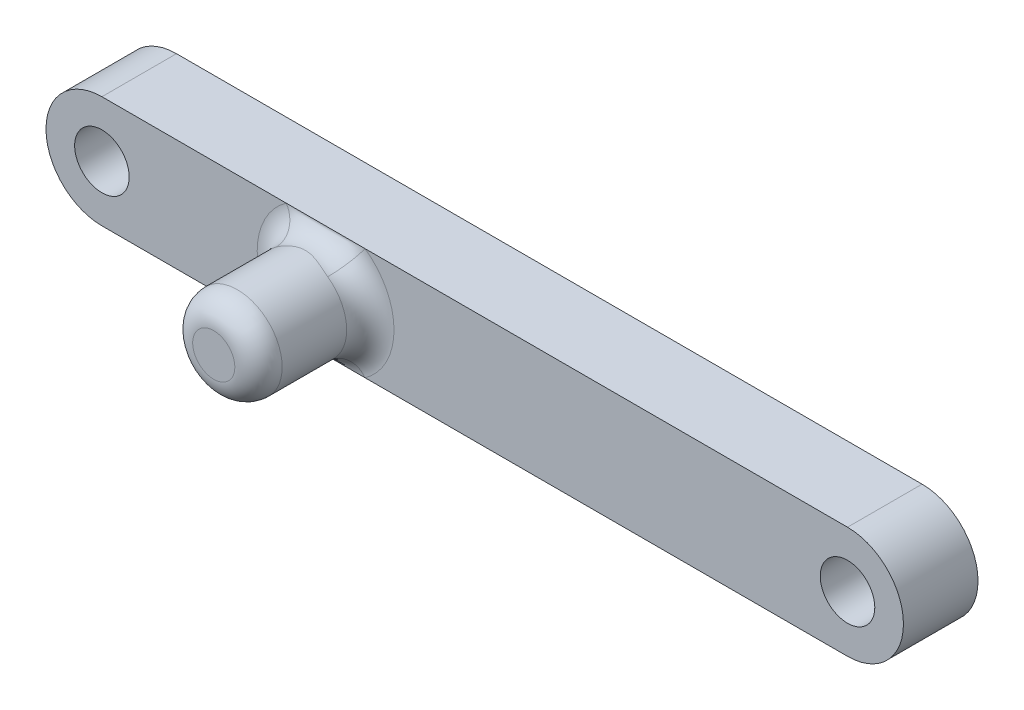
ISO-10303-21;
HEADER;
FILE_DESCRIPTION(('STEP AP214'),'2;1');
FILE_NAME('part.step','',(''),(''),'','','');
FILE_SCHEMA(('AUTOMOTIVE_DESIGN { 1 0 10303 214 1 1 1 1 }'));
ENDSEC;
DATA;
#1=APPLICATION_CONTEXT('core data for automotive mechanical design processes');
#2=APPLICATION_PROTOCOL_DEFINITION('international standard','automotive_design',2000,#1);
#3=PRODUCT_CONTEXT('',#1,'mechanical');
#4=PRODUCT('Part','Part','',(#3));
#5=PRODUCT_RELATED_PRODUCT_CATEGORY('part','',(#4));
#6=PRODUCT_DEFINITION_FORMATION('','',#4);
#7=PRODUCT_DEFINITION_CONTEXT('part definition',#1,'design');
#8=PRODUCT_DEFINITION('design','',#6,#7);
#9=PRODUCT_DEFINITION_SHAPE('','',#8);
#10=(LENGTH_UNIT() NAMED_UNIT(*) SI_UNIT(.MILLI.,.METRE.));
#11=(NAMED_UNIT(*) PLANE_ANGLE_UNIT() SI_UNIT($,.RADIAN.));
#12=(NAMED_UNIT(*) SI_UNIT($,.STERADIAN.) SOLID_ANGLE_UNIT());
#13=UNCERTAINTY_MEASURE_WITH_UNIT(LENGTH_MEASURE(1.E-05),#10,'distance_accuracy_value','');
#14=(GEOMETRIC_REPRESENTATION_CONTEXT(3) GLOBAL_UNCERTAINTY_ASSIGNED_CONTEXT((#13)) GLOBAL_UNIT_ASSIGNED_CONTEXT((#10,
#11,#12)) REPRESENTATION_CONTEXT('',''));
#15=CARTESIAN_POINT('',(0.,0.,0.));
#16=DIRECTION('',(0.,0.,1.));
#17=DIRECTION('',(1.,0.,0.));
#18=AXIS2_PLACEMENT_3D('',#15,#16,#17);
#19=CARTESIAN_POINT('',(0.,0.,10.));
#20=DIRECTION('',(0.,0.,1.));
#21=DIRECTION('',(1.,0.,0.));
#22=AXIS2_PLACEMENT_3D('',#19,#20,#21);
#23=PLANE('',#22);
#24=CARTESIAN_POINT('',(0.,0.,10.));
#25=DIRECTION('',(0.,0.,1.));
#26=DIRECTION('',(1.,0.,0.));
#27=AXIS2_PLACEMENT_3D('',#24,#25,#26);
#28=CIRCLE('',#27,3.6576);
#29=CARTESIAN_POINT('',(3.6576,0.,10.));
#30=VERTEX_POINT('',#29);
#31=EDGE_CURVE('E230',#30,#30,#28,.T.);
#32=ORIENTED_EDGE('',*,*,#31,.F.);
#33=EDGE_LOOP('',(#32));
#34=FACE_BOUND('',#33,.T.);
#35=DIRECTION('',(1.,0.,0.));
#36=VECTOR('',#35,1.);
#37=CARTESIAN_POINT('',(0.,-7.5,10.));
#38=LINE('',#37,#36);
#39=CARTESIAN_POINT('',(0.,-7.5,10.));
#40=VERTEX_POINT('',#39);
#41=CARTESIAN_POINT('',(24.7150567647325,-7.5,10.));
#42=VERTEX_POINT('',#41);
#43=EDGE_CURVE('E112',#40,#42,#38,.T.);
#44=ORIENTED_EDGE('',*,*,#43,.T.);
#45=CARTESIAN_POINT('',(30.,0.,10.));
#46=DIRECTION('',(0.,0.,1.));
#47=DIRECTION('',(1.,0.,0.));
#48=AXIS2_PLACEMENT_3D('',#45,#46,#47);
#49=CIRCLE('',#48,9.175);
#50=CARTESIAN_POINT('',(24.7150567647325,7.5,10.));
#51=VERTEX_POINT('',#50);
#52=EDGE_CURVE('E53',#42,#51,#49,.F.);
#53=ORIENTED_EDGE('',*,*,#52,.T.);
#54=DIRECTION('',(-1.,0.,0.));
#55=VECTOR('',#54,1.);
#56=CARTESIAN_POINT('',(0.,7.5,10.));
#57=LINE('',#56,#55);
#58=CARTESIAN_POINT('',(0.,7.5,10.));
#59=VERTEX_POINT('',#58);
#60=EDGE_CURVE('E126',#51,#59,#57,.T.);
#61=ORIENTED_EDGE('',*,*,#60,.T.);
#62=CARTESIAN_POINT('',(0.,0.,10.));
#63=DIRECTION('',(0.,0.,1.));
#64=DIRECTION('',(1.,0.,0.));
#65=AXIS2_PLACEMENT_3D('',#62,#63,#64);
#66=CIRCLE('',#65,7.5);
#67=EDGE_CURVE('E125',#59,#40,#66,.T.);
#68=ORIENTED_EDGE('',*,*,#67,.T.);
#69=EDGE_LOOP('',(#44,#53,#61,#68));
#70=FACE_BOUND('',#69,.T.);
#71=ADVANCED_FACE('F39',(#34,#70),#23,.T.);
#72=CARTESIAN_POINT('',(100.,7.5,10.));
#73=VERTEX_POINT('',#72);
#74=CARTESIAN_POINT('',(35.2849432352675,7.5,10.));
#75=VERTEX_POINT('',#74);
#76=EDGE_CURVE('E243',#73,#75,#57,.T.);
#77=ORIENTED_EDGE('',*,*,#76,.T.);
#78=CARTESIAN_POINT('',(30.,0.,10.));
#79=DIRECTION('',(0.,0.,1.));
#80=DIRECTION('',(1.,0.,0.));
#81=AXIS2_PLACEMENT_3D('',#78,#79,#80);
#82=CIRCLE('',#81,9.175);
#83=CARTESIAN_POINT('',(35.2849432352675,-7.5,10.));
#84=VERTEX_POINT('',#83);
#85=EDGE_CURVE('E263',#75,#84,#82,.F.);
#86=ORIENTED_EDGE('',*,*,#85,.T.);
#87=CARTESIAN_POINT('',(100.,-7.5,10.));
#88=VERTEX_POINT('',#87);
#89=EDGE_CURVE('E123',#84,#88,#38,.T.);
#90=ORIENTED_EDGE('',*,*,#89,.T.);
#91=CARTESIAN_POINT('',(100.,0.,10.));
#92=DIRECTION('',(0.,0.,1.));
#93=DIRECTION('',(1.,0.,0.));
#94=AXIS2_PLACEMENT_3D('',#91,#92,#93);
#95=CIRCLE('',#94,7.5);
#96=EDGE_CURVE('E121',#88,#73,#95,.T.);
#97=ORIENTED_EDGE('',*,*,#96,.T.);
#98=EDGE_LOOP('',(#77,#86,#90,#97));
#99=FACE_BOUND('',#98,.T.);
#100=CARTESIAN_POINT('',(100.,0.,10.));
#101=DIRECTION('',(0.,0.,1.));
#102=DIRECTION('',(1.,0.,0.));
#103=AXIS2_PLACEMENT_3D('',#100,#101,#102);
#104=CIRCLE('',#103,3.6576);
#105=CARTESIAN_POINT('',(103.6576,0.,10.));
#106=VERTEX_POINT('',#105);
#107=EDGE_CURVE('E237',#106,#106,#104,.T.);
#108=ORIENTED_EDGE('',*,*,#107,.F.);
#109=EDGE_LOOP('',(#108));
#110=FACE_BOUND('',#109,.T.);
#111=ADVANCED_FACE('F181',(#99,#110),#23,.T.);
#112=CARTESIAN_POINT('',(0.,0.,0.));
#113=DIRECTION('',(0.,0.,1.));
#114=DIRECTION('',(1.,0.,0.));
#115=AXIS2_PLACEMENT_3D('',#112,#113,#114);
#116=PLANE('',#115);
#117=CARTESIAN_POINT('',(0.,0.,0.));
#118=DIRECTION('',(0.,0.,1.));
#119=DIRECTION('',(1.,0.,0.));
#120=AXIS2_PLACEMENT_3D('',#117,#118,#119);
#121=CIRCLE('',#120,7.5);
#122=CARTESIAN_POINT('',(0.,7.5,0.));
#123=VERTEX_POINT('',#122);
#124=CARTESIAN_POINT('',(0.,-7.5,0.));
#125=VERTEX_POINT('',#124);
#126=EDGE_CURVE('E134',#123,#125,#121,.T.);
#127=ORIENTED_EDGE('',*,*,#126,.F.);
#128=DIRECTION('',(-1.,0.,0.));
#129=VECTOR('',#128,1.);
#130=CARTESIAN_POINT('',(0.,7.5,0.));
#131=LINE('',#130,#129);
#132=CARTESIAN_POINT('',(100.,7.5,0.));
#133=VERTEX_POINT('',#132);
#134=EDGE_CURVE('E130',#133,#123,#131,.T.);
#135=ORIENTED_EDGE('',*,*,#134,.F.);
#136=CARTESIAN_POINT('',(100.,0.,0.));
#137=DIRECTION('',(0.,0.,1.));
#138=DIRECTION('',(1.,0.,0.));
#139=AXIS2_PLACEMENT_3D('',#136,#137,#138);
#140=CIRCLE('',#139,7.5);
#141=CARTESIAN_POINT('',(100.,-7.5,0.));
#142=VERTEX_POINT('',#141);
#143=EDGE_CURVE('E247',#142,#133,#140,.T.);
#144=ORIENTED_EDGE('',*,*,#143,.F.);
#145=DIRECTION('',(1.,0.,0.));
#146=VECTOR('',#145,1.);
#147=CARTESIAN_POINT('',(0.,-7.5,0.));
#148=LINE('',#147,#146);
#149=EDGE_CURVE('E234',#125,#142,#148,.T.);
#150=ORIENTED_EDGE('',*,*,#149,.F.);
#151=EDGE_LOOP('',(#127,#135,#144,#150));
#152=FACE_BOUND('',#151,.T.);
#153=CARTESIAN_POINT('',(0.,0.,0.));
#154=DIRECTION('',(0.,0.,1.));
#155=DIRECTION('',(1.,0.,0.));
#156=AXIS2_PLACEMENT_3D('',#153,#154,#155);
#157=CIRCLE('',#156,3.6576);
#158=CARTESIAN_POINT('',(3.6576,0.,0.));
#159=VERTEX_POINT('',#158);
#160=EDGE_CURVE('E232',#159,#159,#157,.T.);
#161=ORIENTED_EDGE('',*,*,#160,.T.);
#162=EDGE_LOOP('',(#161));
#163=FACE_BOUND('',#162,.T.);
#164=CARTESIAN_POINT('',(100.,0.,0.));
#165=DIRECTION('',(0.,0.,1.));
#166=DIRECTION('',(1.,0.,0.));
#167=AXIS2_PLACEMENT_3D('',#164,#165,#166);
#168=CIRCLE('',#167,3.6576);
#169=CARTESIAN_POINT('',(103.6576,0.,0.));
#170=VERTEX_POINT('',#169);
#171=EDGE_CURVE('E193',#170,#170,#168,.T.);
#172=ORIENTED_EDGE('',*,*,#171,.T.);
#173=EDGE_LOOP('',(#172));
#174=FACE_BOUND('',#173,.T.);
#175=ADVANCED_FACE('F226',(#152,#163,#174),#116,.F.);
#176=CARTESIAN_POINT('',(0.,0.,10.));
#177=DIRECTION('',(0.,0.,-1.));
#178=DIRECTION('',(-1.,0.,0.));
#179=AXIS2_PLACEMENT_3D('',#176,#177,#178);
#180=CYLINDRICAL_SURFACE('',#179,7.5);
#181=ORIENTED_EDGE('',*,*,#126,.T.);
#182=DIRECTION('',(0.,0.,-1.));
#183=VECTOR('',#182,1.);
#184=CARTESIAN_POINT('',(0.,-7.5,10.));
#185=LINE('',#184,#183);
#186=EDGE_CURVE('E116',#40,#125,#185,.T.);
#187=ORIENTED_EDGE('',*,*,#186,.F.);
#188=ORIENTED_EDGE('',*,*,#67,.F.);
#189=DIRECTION('',(0.,0.,-1.));
#190=VECTOR('',#189,1.);
#191=CARTESIAN_POINT('',(0.,7.5,10.));
#192=LINE('',#191,#190);
#193=EDGE_CURVE('E244',#59,#123,#192,.T.);
#194=ORIENTED_EDGE('',*,*,#193,.T.);
#195=EDGE_LOOP('',(#181,#187,#188,#194));
#196=FACE_BOUND('',#195,.T.);
#197=ADVANCED_FACE('F132',(#196),#180,.T.);
#198=CARTESIAN_POINT('',(0.,-7.5,10.));
#199=DIRECTION('',(0.,1.,0.));
#200=DIRECTION('',(0.,0.,1.));
#201=AXIS2_PLACEMENT_3D('',#198,#199,#200);
#202=PLANE('',#201);
#203=ORIENTED_EDGE('',*,*,#149,.T.);
#204=DIRECTION('',(0.,0.,-1.));
#205=VECTOR('',#204,1.);
#206=CARTESIAN_POINT('',(100.,-7.5,10.));
#207=LINE('',#206,#205);
#208=EDGE_CURVE('E136',#88,#142,#207,.T.);
#209=ORIENTED_EDGE('',*,*,#208,.F.);
#210=ORIENTED_EDGE('',*,*,#89,.F.);
#211=EDGE_CURVE('E120',#42,#84,#38,.T.);
#212=ORIENTED_EDGE('',*,*,#211,.F.);
#213=ORIENTED_EDGE('',*,*,#43,.F.);
#214=ORIENTED_EDGE('',*,*,#186,.T.);
#215=EDGE_LOOP('',(#203,#209,#210,#212,#213,#214));
#216=FACE_BOUND('',#215,.T.);
#217=ADVANCED_FACE('F114',(#216),#202,.F.);
#218=CARTESIAN_POINT('',(100.,0.,10.));
#219=DIRECTION('',(0.,0.,-1.));
#220=DIRECTION('',(-1.,0.,0.));
#221=AXIS2_PLACEMENT_3D('',#218,#219,#220);
#222=CYLINDRICAL_SURFACE('',#221,7.5);
#223=ORIENTED_EDGE('',*,*,#143,.T.);
#224=DIRECTION('',(0.,0.,-1.));
#225=VECTOR('',#224,1.);
#226=CARTESIAN_POINT('',(100.,7.5,10.));
#227=LINE('',#226,#225);
#228=EDGE_CURVE('E142',#73,#133,#227,.T.);
#229=ORIENTED_EDGE('',*,*,#228,.F.);
#230=ORIENTED_EDGE('',*,*,#96,.F.);
#231=ORIENTED_EDGE('',*,*,#208,.T.);
#232=EDGE_LOOP('',(#223,#229,#230,#231));
#233=FACE_BOUND('',#232,.T.);
#234=ADVANCED_FACE('F259',(#233),#222,.T.);
#235=CARTESIAN_POINT('',(0.,7.5,10.));
#236=DIRECTION('',(0.,-1.,0.));
#237=DIRECTION('',(0.,0.,-1.));
#238=AXIS2_PLACEMENT_3D('',#235,#236,#237);
#239=PLANE('',#238);
#240=ORIENTED_EDGE('',*,*,#134,.T.);
#241=ORIENTED_EDGE('',*,*,#193,.F.);
#242=ORIENTED_EDGE('',*,*,#60,.F.);
#243=EDGE_CURVE('E67',#75,#51,#57,.T.);
#244=ORIENTED_EDGE('',*,*,#243,.F.);
#245=ORIENTED_EDGE('',*,*,#76,.F.);
#246=ORIENTED_EDGE('',*,*,#228,.T.);
#247=EDGE_LOOP('',(#240,#241,#242,#244,#245,#246));
#248=FACE_BOUND('',#247,.T.);
#249=ADVANCED_FACE('F185',(#248),#239,.F.);
#250=CARTESIAN_POINT('',(0.,0.,10.));
#251=DIRECTION('',(0.,0.,-1.));
#252=DIRECTION('',(-1.,0.,0.));
#253=AXIS2_PLACEMENT_3D('',#250,#251,#252);
#254=CYLINDRICAL_SURFACE('',#253,3.6576);
#255=ORIENTED_EDGE('',*,*,#31,.T.);
#256=EDGE_LOOP('',(#255));
#257=FACE_BOUND('',#256,.T.);
#258=ORIENTED_EDGE('',*,*,#160,.F.);
#259=EDGE_LOOP('',(#258));
#260=FACE_BOUND('',#259,.T.);
#261=ADVANCED_FACE('F352',(#257,#260),#254,.F.);
#262=CARTESIAN_POINT('',(100.,0.,10.));
#263=DIRECTION('',(0.,0.,-1.));
#264=DIRECTION('',(-1.,0.,0.));
#265=AXIS2_PLACEMENT_3D('',#262,#263,#264);
#266=CYLINDRICAL_SURFACE('',#265,3.6576);
#267=ORIENTED_EDGE('',*,*,#107,.T.);
#268=EDGE_LOOP('',(#267));
#269=FACE_BOUND('',#268,.T.);
#270=ORIENTED_EDGE('',*,*,#171,.F.);
#271=EDGE_LOOP('',(#270));
#272=FACE_BOUND('',#271,.T.);
#273=ADVANCED_FACE('F284',(#269,#272),#266,.F.);
#274=CARTESIAN_POINT('',(30.,0.,25.));
#275=DIRECTION('',(0.,0.,-1.));
#276=DIRECTION('',(-1.,0.,0.));
#277=AXIS2_PLACEMENT_3D('',#274,#275,#276);
#278=CYLINDRICAL_SURFACE('',#277,6.);
#279=CARTESIAN_POINT('',(30.,0.,13.175));
#280=DIRECTION('',(0.,0.,1.));
#281=DIRECTION('',(1.,0.,0.));
#282=AXIS2_PLACEMENT_3D('',#279,#280,#281);
#283=CIRCLE('',#282,6.);
#284=CARTESIAN_POINT('',(26.5439063311602,4.90463215258856,13.175));
#285=VERTEX_POINT('',#284);
#286=CARTESIAN_POINT('',(26.5439063311602,-4.90463215258856,13.175));
#287=VERTEX_POINT('',#286);
#288=EDGE_CURVE('E139',#285,#287,#283,.T.);
#289=ORIENTED_EDGE('',*,*,#288,.T.);
#290=CARTESIAN_POINT('',(25.5669669829592,-4.04329299826589,12.8889082026861));
#291=CARTESIAN_POINT('',(26.4772210505719,-5.04128803284628,8.87900693673398));
#292=CARTESIAN_POINT('',(23.2211536781084,-7.5,10.));
#293=CARTESIAN_POINT('',(25.6229822296809,-4.10474016337067,12.9317363421263));
#294=CARTESIAN_POINT('',(26.4509699333785,-4.98494829048696,8.94901666783968));
#295=CARTESIAN_POINT('',(23.3068103262076,-7.5,10.));
#296=CARTESIAN_POINT('',(25.6811024901604,-4.16586701176025,12.968832398423));
#297=CARTESIAN_POINT('',(26.4298188078775,-4.93981621827615,9.02457923177141));
#298=CARTESIAN_POINT('',(23.3956858911897,-7.5,10.));
#299=CARTESIAN_POINT('',(25.8009654602138,-4.28663758152198,13.03267335236));
#300=CARTESIAN_POINT('',(26.3999989013364,-4.87130013245614,9.17963478321719));
#301=CARTESIAN_POINT('',(23.5789763495683,-7.5,10.));
#302=CARTESIAN_POINT('',(25.8627010028993,-4.34628392435865,13.0594379809215));
#303=CARTESIAN_POINT('',(26.3910507460729,-4.84743836713209,9.25895039779023));
#304=CARTESIAN_POINT('',(23.6733802835979,-7.5,10.));
#305=CARTESIAN_POINT('',(25.9887347139764,-4.46285340702709,13.1036421275061));
#306=CARTESIAN_POINT('',(26.3865351157904,-4.81867252560223,9.41563361301545));
#307=CARTESIAN_POINT('',(23.8661068334579,-7.5,10.));
#308=CARTESIAN_POINT('',(26.0529975990264,-4.51979914898467,13.1211801449361));
#309=CARTESIAN_POINT('',(26.3905407062459,-4.81317518323617,9.4929823649689));
#310=CARTESIAN_POINT('',(23.9643754951784,-7.5,10.));
#311=CARTESIAN_POINT('',(26.1843500284144,-4.63122418975108,13.1485356927104));
#312=CARTESIAN_POINT('',(26.4114000716842,-4.81693313829289,9.64330107730137));
#313=CARTESIAN_POINT('',(24.1652352517831,-7.5,10.));
#314=CARTESIAN_POINT('',(26.2514412917672,-4.68570194561204,13.1583484544436));
#315=CARTESIAN_POINT('',(26.4279897373813,-4.82588520754349,9.71636081965528));
#316=CARTESIAN_POINT('',(24.2678289753272,-7.5,10.));
#317=CARTESIAN_POINT('',(26.4232847895552,-4.81915660131278,13.1747067190602));
#318=CARTESIAN_POINT('',(26.4847526449871,-4.86235997298243,9.8909458135833));
#319=CARTESIAN_POINT('',(24.5306063240285,-7.5,10.));
#320=CARTESIAN_POINT('',(26.5296401600911,-4.8963037247688,13.1769678516294));
#321=CARTESIAN_POINT('',(26.5324424952559,-4.89672642508817,9.98961253743537));
#322=CARTESIAN_POINT('',(24.6932414114726,-7.5,10.));
#323=CARTESIAN_POINT('',(26.7470455233795,-5.04336652253773,13.1699002486503));
#324=CARTESIAN_POINT('',(26.6523099542852,-4.98071690917478,10.1687011909209));
#325=CARTESIAN_POINT('',(25.0256904461678,-7.5,10.));
#326=CARTESIAN_POINT('',(26.8580972453828,-5.11327949991451,13.1605672074633));
#327=CARTESIAN_POINT('',(26.7239002958728,-5.02998231164763,10.2497706293485));
#328=CARTESIAN_POINT('',(25.1955070377312,-7.5,10.));
#329=CARTESIAN_POINT('',(27.19855860536,-5.31236921354693,13.1199441979814));
#330=CARTESIAN_POINT('',(26.9672978136378,-5.18645724422952,10.4636328557361));
#331=CARTESIAN_POINT('',(25.7161292006964,-7.5,10.));
#332=CARTESIAN_POINT('',(27.4341221008171,-5.43000386716694,13.0759953406547));
#333=CARTESIAN_POINT('',(27.1716405422429,-5.30567202331383,10.5750731564631));
#334=CARTESIAN_POINT('',(26.0763450458327,-7.5,10.));
#335=CARTESIAN_POINT('',(27.9324593712012,-5.63940003794259,12.9745759156868));
#336=CARTESIAN_POINT('',(27.6490303193638,-5.53463478174822,10.7447911650842));
#337=CARTESIAN_POINT('',(26.838385788462,-7.5,10.));
#338=CARTESIAN_POINT('',(28.1960161181791,-5.72913732437556,12.9164423864975));
#339=CARTESIAN_POINT('',(27.9265499267676,-5.64570659169011,10.8031567286133));
#340=CARTESIAN_POINT('',(27.2414079807164,-7.5,10.));
#341=CARTESIAN_POINT('',(28.5989953398241,-5.83578804286412,12.8384375756106));
#342=CARTESIAN_POINT('',(28.3720973768654,-5.7816575876033,10.8624305984964));
#343=CARTESIAN_POINT('',(27.8576303738139,-7.5,10.));
#344=CARTESIAN_POINT('',(28.7344485722194,-5.8666611604538,12.8139895538929));
#345=CARTESIAN_POINT('',(28.524361220232,-5.8218271053695,10.8775750885577));
#346=CARTESIAN_POINT('',(28.0647609416841,-7.5,10.));
#347=CARTESIAN_POINT('',(29.0075258275677,-5.91897927148522,12.7706998584466));
#348=CARTESIAN_POINT('',(28.8354677198826,-5.89055270458287,10.9012526106819));
#349=CARTESIAN_POINT('',(28.4823415779876,-7.5,10.));
#350=CARTESIAN_POINT('',(29.1451491556221,-5.94042722196061,12.751856426945));
#351=CARTESIAN_POINT('',(28.9947773931351,-5.91934348649538,10.9098927789759));
#352=CARTESIAN_POINT('',(28.6927905838051,-7.5,10.));
#353=CARTESIAN_POINT('',(29.4494393995016,-5.97702132072375,12.7189649347153));
#354=CARTESIAN_POINT('',(29.3493023174865,-5.96854772449245,10.9238217954188));
#355=CARTESIAN_POINT('',(29.1581010817384,-7.5,10.));
#356=CARTESIAN_POINT('',(29.616445456718,-5.99006952995567,12.7066128309505));
#357=CARTESIAN_POINT('',(29.5464920209929,-5.98644475304943,10.9281936369676));
#358=CARTESIAN_POINT('',(29.4134811775648,-7.5,10.));
#359=CARTESIAN_POINT('',(29.951170302545,-6.00213810118078,12.69521038711));
#360=CARTESIAN_POINT('',(29.9418768738615,-6.00290311938155,10.9322381817446));
#361=CARTESIAN_POINT('',(29.9253312543082,-7.5,10.));
#362=CARTESIAN_POINT('',(30.118889117766,-6.0011579347548,12.6961605481024));
#363=CARTESIAN_POINT('',(30.1411035893687,-6.0015502416789,10.9319318499437));
#364=CARTESIAN_POINT('',(30.1818012759166,-7.5,10.));
#365=CARTESIAN_POINT('',(30.453671694632,-5.98517487446839,12.7112038045376));
#366=CARTESIAN_POINT('',(30.5361774699548,-5.9797759863949,10.9265182650574));
#367=CARTESIAN_POINT('',(30.6937396330419,-7.5,10.));
#368=CARTESIAN_POINT('',(30.6207338758316,-5.97014834948129,12.7253190483889));
#369=CARTESIAN_POINT('',(30.7330462983182,-5.95920792814385,10.9213742619107));
#370=CARTESIAN_POINT('',(30.9492055517944,-7.5,10.));
#371=CARTESIAN_POINT('',(30.9524739976944,-5.92628039986815,12.764311830984));
#372=CARTESIAN_POINT('',(31.1186046370522,-5.90036667934872,10.9042300101128));
#373=CARTESIAN_POINT('',(31.4564914881429,-7.5,10.));
#374=CARTESIAN_POINT('',(31.1171517571547,-5.89743793092382,12.789190183275));
#375=CARTESIAN_POINT('',(31.3082233831363,-5.86179299612625,10.8921279961538));
#376=CARTESIAN_POINT('',(31.7083112286492,-7.5,10.));
#377=CARTESIAN_POINT('',(31.423871323451,-5.83045971594549,12.8423929763754));
#378=CARTESIAN_POINT('',(31.6532851604282,-5.77492733589752,10.8595662892281));
#379=CARTESIAN_POINT('',(32.1773365654437,-7.5,10.));
#380=CARTESIAN_POINT('',(31.566299402411,-5.79381400622619,12.8699691002453));
#381=CARTESIAN_POINT('',(31.8109171795694,-5.72792978473884,10.8400667158781));
#382=CARTESIAN_POINT('',(32.3951328361877,-7.5,10.));
#383=CARTESIAN_POINT('',(31.8479289144523,-5.71023071727664,12.9271077936));
#384=CARTESIAN_POINT('',(32.1138115594845,-5.62449834729478,10.7898242748067));
#385=CARTESIAN_POINT('',(32.8257912983509,-7.5,10.));
#386=CARTESIAN_POINT('',(31.9871302710379,-5.66329289432695,12.9566704101139));
#387=CARTESIAN_POINT('',(32.2594430346449,-5.56771698526649,10.7588046683111));
#388=CARTESIAN_POINT('',(33.0386533727954,-7.5,10.));
#389=CARTESIAN_POINT('',(32.2618614158409,-5.5592767599357,13.0142427087926));
#390=CARTESIAN_POINT('',(32.5351751517084,-5.44812023607145,10.6820672764527));
#391=CARTESIAN_POINT('',(33.4587630817233,-7.5,10.));
#392=CARTESIAN_POINT('',(32.3973907703489,-5.50219725660034,13.0422522079201));
#393=CARTESIAN_POINT('',(32.665451433648,-5.38496614215167,10.6359096015095));
#394=CARTESIAN_POINT('',(33.6660100529926,-7.5,10.));
#395=CARTESIAN_POINT('',(32.6642042739799,-5.37807183980041,13.0929162406209));
#396=CARTESIAN_POINT('',(32.9066865044617,-5.25761147224172,10.5255354204933));
#397=CARTESIAN_POINT('',(34.0740123689618,-7.5,10.));
#398=CARTESIAN_POINT('',(32.7954896934392,-5.31102894294732,13.1155723896664));
#399=CARTESIAN_POINT('',(33.0175780523708,-5.19317172231836,10.4606926649713));
#400=CARTESIAN_POINT('',(34.2747696562177,-7.5,10.));
#401=CARTESIAN_POINT('',(33.1062192079128,-5.13758375338957,13.1588844565465));
#402=CARTESIAN_POINT('',(33.2577035815292,-5.04410925455074,10.2779345885838));
#403=CARTESIAN_POINT('',(34.7499268720996,-7.5,10.));
#404=CARTESIAN_POINT('',(33.2832884823645,-5.02632737612781,13.1748942272467));
#405=CARTESIAN_POINT('',(33.3728122938059,-4.96327076838464,10.1486081742448));
#406=CARTESIAN_POINT('',(35.0206953042823,-7.5,10.));
#407=CARTESIAN_POINT('',(33.6243101846365,-4.78616895009615,13.1751039737547));
#408=CARTESIAN_POINT('',(33.5410889983764,-4.84478779774775,9.84833385568637));
#409=CARTESIAN_POINT('',(35.5421743240067,-7.5,10.));
#410=CARTESIAN_POINT('',(33.7883241207004,-4.65735849135079,13.1594635771331));
#411=CARTESIAN_POINT('',(33.5918815615305,-4.80879738444893,9.67490915842625));
#412=CARTESIAN_POINT('',(35.7929789679043,-7.5,10.));
#413=CARTESIAN_POINT('',(34.0014314234944,-4.4715160896422,13.106133666053));
#414=CARTESIAN_POINT('',(33.6127843516415,-4.81812781963778,9.42778372166664));
#415=CARTESIAN_POINT('',(36.1188555517602,-7.5,10.));
#416=CARTESIAN_POINT('',(34.0578960571341,-4.42032100086197,13.0885115846629));
#417=CARTESIAN_POINT('',(33.6133228692582,-4.82702284172874,9.35840971700718));
#418=CARTESIAN_POINT('',(36.2051993873676,-7.5,10.));
#419=CARTESIAN_POINT('',(34.1682139522841,-4.31644694443828,13.0460475485204));
#420=CARTESIAN_POINT('',(33.6046145861499,-4.85922684866008,9.21955049080244));
#421=CARTESIAN_POINT('',(36.3738938353679,-7.5,10.));
#422=CARTESIAN_POINT('',(34.2220685316292,-4.26376874732277,13.0212092825313));
#423=CARTESIAN_POINT('',(33.5951784960209,-4.8828104288008,9.15009342172199));
#424=CARTESIAN_POINT('',(36.4562464629496,-7.5,10.));
#425=CARTESIAN_POINT('',(34.3273801234203,-4.15685640820346,12.9632217901432));
#426=CARTESIAN_POINT('',(33.5668903505693,-4.94676682133864,9.01371314589371));
#427=CARTESIAN_POINT('',(36.6172854387302,-7.5,10.));
#428=CARTESIAN_POINT('',(34.3788083387217,-4.10261205771451,12.929993210177));
#429=CARTESIAN_POINT('',(33.5477713565804,-4.98760643034872,8.94695947051001));
#430=CARTESIAN_POINT('',(36.6959277512957,-7.5,10.));
#431=CARTESIAN_POINT('',(34.4784218739805,-3.99365085442563,12.854546971049));
#432=CARTESIAN_POINT('',(33.5014747271117,-5.0870447703254,8.82099735697241));
#433=CARTESIAN_POINT('',(36.8482534489624,-7.5,10.));
#434=CARTESIAN_POINT('',(34.5266017737468,-3.93893337577406,12.8123147541392));
#435=CARTESIAN_POINT('',(33.474156292756,-5.14595556004996,8.7620369136544));
#436=CARTESIAN_POINT('',(36.9219285456883,-7.5,10.));
#437=CARTESIAN_POINT('',(34.5729367163089,-3.8843596368815,12.7652314188446));
#438=CARTESIAN_POINT('',(33.4439800423648,-5.21344548577719,8.70990679598452));
#439=CARTESIAN_POINT('',(36.9927823953557,-7.5,10.));
#440=(BOUNDED_SURFACE() B_SPLINE_SURFACE(3,2,((#290,#291,#292),(#293,#294,#295),(#296,#297,
#298),(#299,#300,#301),(#302,#303,#304),(#305,#306,#307),(#308,#309,#310),(#311,#312,#313),
(#314,#315,#316),(#317,#318,#319),(#320,#321,#322),(#323,#324,#325),(#326,#327,#328),(#329,#330,
#331),(#332,#333,#334),(#335,#336,#337),(#338,#339,#340),(#341,#342,#343),(#344,#345,#346),
(#347,#348,#349),(#350,#351,#352),(#353,#354,#355),(#356,#357,#358),(#359,#360,#361),(#362,#363,
#364),(#365,#366,#367),(#368,#369,#370),(#371,#372,#373),(#374,#375,#376),(#377,#378,#379),
(#380,#381,#382),(#383,#384,#385),(#386,#387,#388),(#389,#390,#391),(#392,#393,#394),(#395,#396,
#397),(#398,#399,#400),(#401,#402,#403),(#404,#405,#406),(#407,#408,#409),(#410,#411,#412),
(#413,#414,#415),(#416,#417,#418),(#419,#420,#421),(#422,#423,#424),(#425,#426,#427),(#428,#429,
#430),(#431,#432,#433),(#434,#435,#436),(#437,#438,#439)),.UNSPECIFIED.,.F.,.F.,
.F.) B_SPLINE_SURFACE_WITH_KNOTS((4,2,2,2,2,2,2,2,2,2,2,2,2,2,2,2,2,2,2,2,2,2,2,2,4),(3,3),(0.,
0.40216567703318,0.803559454102876,1.20057640398108,1.59783823096835,2.1996644205517,
2.80171417250746,4.0124231742884,5.29723361670402,5.93828512862059,6.57913537443763,
7.34727801974771,8.11544959943853,8.88491585584337,9.65444028377354,10.3335518200165,
11.0126794395017,11.6918869258353,12.3708891862567,13.32886103317,14.2820133928772,
14.6353918066473,14.9885898976106,15.3452624958731,15.7025162228286),(0.,1.),
.UNSPECIFIED.) GEOMETRIC_REPRESENTATION_ITEM() RATIONAL_B_SPLINE_SURFACE(((1.,0.60018485670738,
1.),(1.,0.606719965358706,1.),(1.,0.613497757085728,1.),(1.,0.627358452783652,1.),(1.,
0.634440746165938,1.),(1.,0.648678508354341,1.),(1.,0.655832337173973,1.),(1.,0.670154094336123,
1.),(1.,0.67732202865357,1.),(1.,0.695214830179623,1.),(1.,0.705870647800572,1.),(1.,
0.726617906091147,1.),(1.,0.736709135639371,1.),(1.,0.7658992127339,1.),(1.,0.783790551460652,
1.),(1.,0.816162898588367,1.),(1.,0.830368155853741,1.),(1.,0.847396738228987,1.),(1.,
0.852356724602753,1.),(1.,0.860790389515784,1.),(1.,0.864264534210971,1.),(1.,0.870201947963986,
1.),(1.,0.87232735714094,1.),(1.,0.874292914689489,1.),(1.,0.874132976976914,1.),(1.,
0.871530623703545,1.),(1.,0.869084361707909,1.),(1.,0.861972900245613,1.),(1.,0.857307533041618,
1.),(1.,0.846544731335144,1.),(1.,0.840679955501191,1.),(1.,0.827407906740637,1.),(1.,
0.820000597286721,1.),(1.,0.803756643489336,1.),(1.,0.794919831155497,1.),(1.,0.775969416783193,
1.),(1.,0.765856201339854,1.),(1.,0.740165270888249,1.),(1.,0.724049560286579,1.),(1.,
0.690613948944646,1.),(1.,0.673300514290457,1.),(1.,0.649776518353478,1.),(1.,0.643434856415344,
1.),(1.,0.630897619600107,1.),(1.,0.624701971828634,1.),(1.,0.612506950329412,1.),(1.,
0.606510106969,1.),(1.,0.594890273800683,1.),(1.,0.58926790903394,1.),(1.,0.583899268595504,1.))) REPRESENTATION_ITEM('') SURFACE());
#441=CARTESIAN_POINT('',(25.5669669829592,-4.04329299826589,12.8889082026861));
#442=CARTESIAN_POINT('',(25.6229822296809,-4.10474016337067,12.9317363421263));
#443=CARTESIAN_POINT('',(25.6811024901604,-4.16586701176025,12.968832398423));
#444=CARTESIAN_POINT('',(25.8009654602138,-4.28663758152198,13.03267335236));
#445=CARTESIAN_POINT('',(25.8627010028993,-4.34628392435865,13.0594379809215));
#446=CARTESIAN_POINT('',(25.9887347139764,-4.46285340702709,13.1036421275061));
#447=CARTESIAN_POINT('',(26.0529975990264,-4.51979914898467,13.1211801449361));
#448=CARTESIAN_POINT('',(26.1843500284144,-4.63122418975108,13.1485356927104));
#449=CARTESIAN_POINT('',(26.2514412917672,-4.68570194561204,13.1583484544436));
#450=CARTESIAN_POINT('',(26.4232847895552,-4.81915660131278,13.1747067190602));
#451=CARTESIAN_POINT('',(26.5296401600911,-4.8963037247688,13.1769678516294));
#452=CARTESIAN_POINT('',(26.7470455233795,-5.04336652253773,13.1699002486503));
#453=CARTESIAN_POINT('',(26.8580972453828,-5.11327949991451,13.1605672074633));
#454=CARTESIAN_POINT('',(27.19855860536,-5.31236921354693,13.1199441979814));
#455=CARTESIAN_POINT('',(27.4341221008171,-5.43000386716694,13.0759953406547));
#456=CARTESIAN_POINT('',(27.9324593712012,-5.63940003794259,12.9745759156868));
#457=CARTESIAN_POINT('',(28.1960161181791,-5.72913732437556,12.9164423864975));
#458=CARTESIAN_POINT('',(28.5989953398241,-5.83578804286412,12.8384375756106));
#459=CARTESIAN_POINT('',(28.7344485722194,-5.86666116045381,12.8139895538929));
#460=CARTESIAN_POINT('',(29.0075258275677,-5.91897927148522,12.7706998584466));
#461=CARTESIAN_POINT('',(29.1451491556221,-5.94042722196061,12.751856426945));
#462=CARTESIAN_POINT('',(29.4494393995016,-5.97702132072375,12.7189649347153));
#463=CARTESIAN_POINT('',(29.616445456718,-5.99006952995567,12.7066128309505));
#464=CARTESIAN_POINT('',(29.951170302545,-6.00213810118078,12.69521038711));
#465=CARTESIAN_POINT('',(30.118889117766,-6.0011579347548,12.6961605481024));
#466=CARTESIAN_POINT('',(30.453671694632,-5.98517487446839,12.7112038045376));
#467=CARTESIAN_POINT('',(30.6207338758316,-5.97014834948129,12.7253190483889));
#468=CARTESIAN_POINT('',(30.9524739976944,-5.92628039986815,12.764311830984));
#469=CARTESIAN_POINT('',(31.1171517571547,-5.89743793092382,12.789190183275));
#470=CARTESIAN_POINT('',(31.423871323451,-5.83045971594549,12.8423929763754));
#471=CARTESIAN_POINT('',(31.566299402411,-5.79381400622619,12.8699691002453));
#472=CARTESIAN_POINT('',(31.8479289144523,-5.71023071727664,12.9271077936));
#473=CARTESIAN_POINT('',(31.9871302710379,-5.66329289432695,12.9566704101139));
#474=CARTESIAN_POINT('',(32.2618614158409,-5.5592767599357,13.0142427087926));
#475=CARTESIAN_POINT('',(32.3973907703489,-5.50219725660034,13.0422522079201));
#476=CARTESIAN_POINT('',(32.6642042739799,-5.37807183980041,13.0929162406209));
#477=CARTESIAN_POINT('',(32.7954896934392,-5.31102894294732,13.1155723896664));
#478=CARTESIAN_POINT('',(33.1062192079128,-5.13758375338957,13.1588844565465));
#479=CARTESIAN_POINT('',(33.2832884823645,-5.02632737612781,13.1748942272467));
#480=CARTESIAN_POINT('',(33.6243101846365,-4.78616895009615,13.1751039737547));
#481=CARTESIAN_POINT('',(33.7883241207004,-4.65735849135079,13.1594635771331));
#482=CARTESIAN_POINT('',(34.0014314234944,-4.4715160896422,13.106133666053));
#483=CARTESIAN_POINT('',(34.0578960571341,-4.42032100086197,13.0885115846629));
#484=CARTESIAN_POINT('',(34.1682139522841,-4.31644694443828,13.0460475485204));
#485=CARTESIAN_POINT('',(34.2220685316292,-4.26376874732277,13.0212092825313));
#486=CARTESIAN_POINT('',(34.3273801234203,-4.15685640820346,12.9632217901432));
#487=CARTESIAN_POINT('',(34.3788083387217,-4.10261205771451,12.929993210177));
#488=CARTESIAN_POINT('',(34.4784218739805,-3.99365085442563,12.854546971049));
#489=CARTESIAN_POINT('',(34.5266017737468,-3.93893337577406,12.8123147541392));
#490=CARTESIAN_POINT('',(34.5729367163089,-3.8843596368815,12.7652314188446));
#491=B_SPLINE_CURVE_WITH_KNOTS('',3,(#441,#442,#443,#444,#445,#446,#447,#448,#449,#450,#451,
#452,#453,#454,#455,#456,#457,#458,#459,#460,#461,#462,#463,#464,#465,#466,#467,#468,#469,#470,
#471,#472,#473,#474,#475,#476,#477,#478,#479,#480,#481,#482,#483,#484,#485,#486,#487,#488,#489,
#490),.UNSPECIFIED.,.F.,.F.,(4,2,2,2,2,2,2,2,2,2,2,2,2,2,2,2,2,2,2,2,2,2,2,2,4),(0.,
0.40216567703318,0.803559454102876,1.20057640398108,1.59783823096835,2.1996644205517,
2.80171417250746,4.0124231742884,5.29723361670402,5.93828512862059,6.57913537443763,
7.34727801974771,8.11544959943853,8.88491585584337,9.65444028377354,10.3335518200165,
11.0126794395017,11.6918869258353,12.3708891862567,13.32886103317,14.2820133928772,
14.6353918066473,14.9885898976106,15.3452624958731,15.7025162228286),.UNSPECIFIED.);
#492=CARTESIAN_POINT('',(33.4560936688398,-4.90463215258856,13.175));
#493=VERTEX_POINT('',#492);
#494=EDGE_CURVE('E273',#287,#493,#491,.T.);
#495=ORIENTED_EDGE('',*,*,#494,.T.);
#496=CARTESIAN_POINT('',(30.,0.,13.175));
#497=DIRECTION('',(0.,0.,1.));
#498=DIRECTION('',(1.,0.,0.));
#499=AXIS2_PLACEMENT_3D('',#496,#497,#498);
#500=CIRCLE('',#499,6.);
#501=CARTESIAN_POINT('',(33.4560936688398,4.90463215258856,13.175));
#502=VERTEX_POINT('',#501);
#503=EDGE_CURVE('E155',#493,#502,#500,.T.);
#504=ORIENTED_EDGE('',*,*,#503,.T.);
#505=CARTESIAN_POINT('',(34.4330330170408,4.04329299826589,12.8889082026861));
#506=CARTESIAN_POINT('',(33.5227789494281,5.04128803284628,8.87900693673399));
#507=CARTESIAN_POINT('',(36.7788463218916,7.5,10.));
#508=CARTESIAN_POINT('',(34.3770177703191,4.10474016337067,12.9317363421263));
#509=CARTESIAN_POINT('',(33.5490300666215,4.98494829048695,8.94901666783969));
#510=CARTESIAN_POINT('',(36.6931896737924,7.5,10.));
#511=CARTESIAN_POINT('',(34.3188975098396,4.16586701176025,12.968832398423));
#512=CARTESIAN_POINT('',(33.5701811921225,4.93981621827614,9.0245792317714));
#513=CARTESIAN_POINT('',(36.6043141088103,7.5,10.));
#514=CARTESIAN_POINT('',(34.1990345397862,4.28663758152198,13.03267335236));
#515=CARTESIAN_POINT('',(33.6000010986636,4.87130013245614,9.17963478321719));
#516=CARTESIAN_POINT('',(36.4210236504317,7.5,10.));
#517=CARTESIAN_POINT('',(34.1372989971007,4.34628392435865,13.0594379809215));
#518=CARTESIAN_POINT('',(33.6089492539271,4.84743836713208,9.25895039779023));
#519=CARTESIAN_POINT('',(36.3266197164021,7.5,10.));
#520=CARTESIAN_POINT('',(34.0112652860236,4.46285340702709,13.1036421275061));
#521=CARTESIAN_POINT('',(33.6134648842096,4.81867252560223,9.41563361301545));
#522=CARTESIAN_POINT('',(36.1338931665421,7.5,10.));
#523=CARTESIAN_POINT('',(33.9470024009736,4.51979914898467,13.1211801449361));
#524=CARTESIAN_POINT('',(33.6094592937541,4.81317518323617,9.49298236496891));
#525=CARTESIAN_POINT('',(36.0356245048216,7.5,10.));
#526=CARTESIAN_POINT('',(33.8156499715856,4.63122418975108,13.1485356927105));
#527=CARTESIAN_POINT('',(33.5885999283158,4.81693313829289,9.64330107730138));
#528=CARTESIAN_POINT('',(35.8347647482169,7.5,10.));
#529=CARTESIAN_POINT('',(33.7485587082328,4.68570194561204,13.1583484544436));
#530=CARTESIAN_POINT('',(33.5720102626187,4.82588520754349,9.71636081965528));
#531=CARTESIAN_POINT('',(35.7321710246728,7.5,10.));
#532=CARTESIAN_POINT('',(33.5767152104448,4.81915660131279,13.1747067190602));
#533=CARTESIAN_POINT('',(33.5152473550129,4.86235997298243,9.8909458135833));
#534=CARTESIAN_POINT('',(35.4693936759715,7.5,10.));
#535=CARTESIAN_POINT('',(33.4703598399089,4.8963037247688,13.1769678516294));
#536=CARTESIAN_POINT('',(33.4675575047441,4.89672642508817,9.98961253743538));
#537=CARTESIAN_POINT('',(35.3067585885274,7.5,10.));
#538=CARTESIAN_POINT('',(33.2529544766205,5.04336652253774,13.1699002486503));
#539=CARTESIAN_POINT('',(33.3476900457148,4.98071690917478,10.1687011909209));
#540=CARTESIAN_POINT('',(34.9743095538322,7.5,10.));
#541=CARTESIAN_POINT('',(33.1419027546172,5.11327949991451,13.1605672074633));
#542=CARTESIAN_POINT('',(33.2760997041272,5.02998231164763,10.2497706293485));
#543=CARTESIAN_POINT('',(34.8044929622688,7.5,10.));
#544=CARTESIAN_POINT('',(32.80144139464,5.31236921354693,13.1199441979814));
#545=CARTESIAN_POINT('',(33.0327021863622,5.18645724422953,10.4636328557361));
#546=CARTESIAN_POINT('',(34.2838707993036,7.5,10.));
#547=CARTESIAN_POINT('',(32.5658778991829,5.43000386716694,13.0759953406547));
#548=CARTESIAN_POINT('',(32.8283594577571,5.30567202331383,10.5750731564631));
#549=CARTESIAN_POINT('',(33.9236549541673,7.5,10.));
#550=CARTESIAN_POINT('',(32.0675406287988,5.63940003794259,12.9745759156868));
#551=CARTESIAN_POINT('',(32.3509696806362,5.53463478174822,10.7447911650842));
#552=CARTESIAN_POINT('',(33.1616142115379,7.5,10.));
#553=CARTESIAN_POINT('',(31.8039838818209,5.72913732437556,12.9164423864975));
#554=CARTESIAN_POINT('',(32.0734500732324,5.64570659169011,10.8031567286133));
#555=CARTESIAN_POINT('',(32.7585920192836,7.5,10.));
#556=CARTESIAN_POINT('',(31.4010046601759,5.83578804286412,12.8384375756106));
#557=CARTESIAN_POINT('',(31.6279026231346,5.7816575876033,10.8624305984964));
#558=CARTESIAN_POINT('',(32.1423696261861,7.5,10.));
#559=CARTESIAN_POINT('',(31.2655514277806,5.8666611604538,12.8139895538929));
#560=CARTESIAN_POINT('',(31.475638779768,5.8218271053695,10.8775750885577));
#561=CARTESIAN_POINT('',(31.9352390583159,7.5,10.));
#562=CARTESIAN_POINT('',(30.9924741724323,5.91897927148522,12.7706998584466));
#563=CARTESIAN_POINT('',(31.1645322801174,5.89055270458287,10.9012526106819));
#564=CARTESIAN_POINT('',(31.5176584220124,7.5,10.));
#565=CARTESIAN_POINT('',(30.8548508443779,5.94042722196061,12.751856426945));
#566=CARTESIAN_POINT('',(31.0052226068649,5.91934348649538,10.9098927789759));
#567=CARTESIAN_POINT('',(31.3072094161949,7.5,10.));
#568=CARTESIAN_POINT('',(30.5505606004984,5.97702132072375,12.7189649347153));
#569=CARTESIAN_POINT('',(30.6506976825135,5.96854772449245,10.9238217954188));
#570=CARTESIAN_POINT('',(30.8418989182616,7.5,10.));
#571=CARTESIAN_POINT('',(30.383554543282,5.99006952995567,12.7066128309505));
#572=CARTESIAN_POINT('',(30.4535079790071,5.98644475304943,10.9281936369676));
#573=CARTESIAN_POINT('',(30.5865188224352,7.5,10.));
#574=CARTESIAN_POINT('',(30.0488296974549,6.00213810118078,12.69521038711));
#575=CARTESIAN_POINT('',(30.0581231261385,6.00290311938155,10.9322381817446));
#576=CARTESIAN_POINT('',(30.0746687456918,7.5,10.));
#577=CARTESIAN_POINT('',(29.881110882234,6.0011579347548,12.6961605481024));
#578=CARTESIAN_POINT('',(29.8588964106313,6.0015502416789,10.9319318499437));
#579=CARTESIAN_POINT('',(29.8181987240834,7.5,10.));
#580=CARTESIAN_POINT('',(29.546328305368,5.98517487446839,12.7112038045376));
#581=CARTESIAN_POINT('',(29.4638225300452,5.9797759863949,10.9265182650574));
#582=CARTESIAN_POINT('',(29.3062603669581,7.5,10.));
#583=CARTESIAN_POINT('',(29.3792661241684,5.97014834948129,12.7253190483889));
#584=CARTESIAN_POINT('',(29.2669537016818,5.95920792814385,10.9213742619107));
#585=CARTESIAN_POINT('',(29.0507944482056,7.5,10.));
#586=CARTESIAN_POINT('',(29.0475260023055,5.92628039986815,12.764311830984));
#587=CARTESIAN_POINT('',(28.8813953629478,5.90036667934872,10.9042300101128));
#588=CARTESIAN_POINT('',(28.5435085118571,7.5,10.));
#589=CARTESIAN_POINT('',(28.8828482428453,5.89743793092382,12.789190183275));
#590=CARTESIAN_POINT('',(28.6917766168637,5.86179299612625,10.8921279961538));
#591=CARTESIAN_POINT('',(28.2916887713508,7.5,10.));
#592=CARTESIAN_POINT('',(28.5761286765489,5.83045971594549,12.8423929763754));
#593=CARTESIAN_POINT('',(28.3467148395717,5.77492733589751,10.8595662892281));
#594=CARTESIAN_POINT('',(27.8226634345562,7.5,10.));
#595=CARTESIAN_POINT('',(28.433700597589,5.79381400622619,12.8699691002453));
#596=CARTESIAN_POINT('',(28.1890828204306,5.72792978473883,10.8400667158781));
#597=CARTESIAN_POINT('',(27.6048671638123,7.5,10.));
#598=CARTESIAN_POINT('',(28.1520710855477,5.71023071727663,12.9271077936));
#599=CARTESIAN_POINT('',(27.8861884405155,5.62449834729478,10.7898242748067));
#600=CARTESIAN_POINT('',(27.174208701649,7.5,10.));
#601=CARTESIAN_POINT('',(28.0128697289621,5.66329289432695,12.9566704101139));
#602=CARTESIAN_POINT('',(27.7405569653551,5.56771698526649,10.7588046683111));
#603=CARTESIAN_POINT('',(26.9613466272045,7.5,10.));
#604=CARTESIAN_POINT('',(27.7381385841591,5.5592767599357,13.0142427087926));
#605=CARTESIAN_POINT('',(27.4648248482916,5.44812023607144,10.6820672764527));
#606=CARTESIAN_POINT('',(26.5412369182767,7.5,10.));
#607=CARTESIAN_POINT('',(27.6026092296511,5.50219725660034,13.0422522079201));
#608=CARTESIAN_POINT('',(27.334548566352,5.38496614215167,10.6359096015095));
#609=CARTESIAN_POINT('',(26.3339899470074,7.5,10.));
#610=CARTESIAN_POINT('',(27.3357957260201,5.3780718398004,13.0929162406209));
#611=CARTESIAN_POINT('',(27.0933134955383,5.25761147224171,10.5255354204933));
#612=CARTESIAN_POINT('',(25.9259876310382,7.5,10.));
#613=CARTESIAN_POINT('',(27.2045103065608,5.31102894294732,13.1155723896664));
#614=CARTESIAN_POINT('',(26.9824219476292,5.19317172231835,10.4606926649713));
#615=CARTESIAN_POINT('',(25.7252303437823,7.5,10.));
#616=CARTESIAN_POINT('',(26.8937807920872,5.13758375338956,13.1588844565465));
#617=CARTESIAN_POINT('',(26.7422964184708,5.04410925455074,10.2779345885838));
#618=CARTESIAN_POINT('',(25.2500731279004,7.5,10.));
#619=CARTESIAN_POINT('',(26.7167115176355,5.0263273761278,13.1748942272467));
#620=CARTESIAN_POINT('',(26.6271877061941,4.96327076838464,10.1486081742447));
#621=CARTESIAN_POINT('',(24.9793046957177,7.5,10.));
#622=CARTESIAN_POINT('',(26.3756898153635,4.78616895009615,13.1751039737547));
#623=CARTESIAN_POINT('',(26.4589110016236,4.84478779774775,9.84833385568637));
#624=CARTESIAN_POINT('',(24.4578256759932,7.5,10.));
#625=CARTESIAN_POINT('',(26.2116758792996,4.65735849135078,13.1594635771331));
#626=CARTESIAN_POINT('',(26.4081184384695,4.80879738444893,9.67490915842625));
#627=CARTESIAN_POINT('',(24.2070210320957,7.5,10.));
#628=CARTESIAN_POINT('',(25.9985685765056,4.4715160896422,13.106133666053));
#629=CARTESIAN_POINT('',(26.3872156483585,4.81812781963778,9.42778372166663));
#630=CARTESIAN_POINT('',(23.8811444482398,7.5,10.));
#631=CARTESIAN_POINT('',(25.9421039428659,4.42032100086197,13.0885115846629));
#632=CARTESIAN_POINT('',(26.3866771307418,4.82702284172874,9.35840971700717));
#633=CARTESIAN_POINT('',(23.7948006126324,7.5,10.));
#634=CARTESIAN_POINT('',(25.8317860477159,4.31644694443827,13.0460475485204));
#635=CARTESIAN_POINT('',(26.39538541385,4.85922684866008,9.21955049080244));
#636=CARTESIAN_POINT('',(23.6261061646321,7.5,10.));
#637=CARTESIAN_POINT('',(25.7779314683708,4.26376874732277,13.0212092825313));
#638=CARTESIAN_POINT('',(26.4048215039791,4.8828104288008,9.15009342172199));
#639=CARTESIAN_POINT('',(23.5437535370504,7.5,10.));
#640=CARTESIAN_POINT('',(25.6726198765797,4.15685640820346,12.9632217901432));
#641=CARTESIAN_POINT('',(26.4331096494307,4.94676682133864,9.01371314589371));
#642=CARTESIAN_POINT('',(23.3827145612697,7.5,10.));
#643=CARTESIAN_POINT('',(25.6211916612783,4.10261205771451,12.929993210177));
#644=CARTESIAN_POINT('',(26.4522286434196,4.98760643034872,8.94695947051001));
#645=CARTESIAN_POINT('',(23.3040722487043,7.5,10.));
#646=CARTESIAN_POINT('',(25.5215781260195,3.99365085442563,12.854546971049));
#647=CARTESIAN_POINT('',(26.4985252728883,5.0870447703254,8.82099735697242));
#648=CARTESIAN_POINT('',(23.1517465510376,7.5,10.));
#649=CARTESIAN_POINT('',(25.4733982262532,3.93893337577406,12.8123147541392));
#650=CARTESIAN_POINT('',(26.525843707244,5.14595556004996,8.7620369136544));
#651=CARTESIAN_POINT('',(23.0780714543117,7.5,10.));
#652=CARTESIAN_POINT('',(25.4270632836911,3.8843596368815,12.7652314188446));
#653=CARTESIAN_POINT('',(26.5560199576352,5.2134454857772,8.70990679598452));
#654=CARTESIAN_POINT('',(23.0072176046443,7.5,10.));
#655=(BOUNDED_SURFACE() B_SPLINE_SURFACE(3,2,((#505,#506,#507),(#508,#509,#510),(#511,#512,
#513),(#514,#515,#516),(#517,#518,#519),(#520,#521,#522),(#523,#524,#525),(#526,#527,#528),
(#529,#530,#531),(#532,#533,#534),(#535,#536,#537),(#538,#539,#540),(#541,#542,#543),(#544,#545,
#546),(#547,#548,#549),(#550,#551,#552),(#553,#554,#555),(#556,#557,#558),(#559,#560,#561),
(#562,#563,#564),(#565,#566,#567),(#568,#569,#570),(#571,#572,#573),(#574,#575,#576),(#577,#578,
#579),(#580,#581,#582),(#583,#584,#585),(#586,#587,#588),(#589,#590,#591),(#592,#593,#594),
(#595,#596,#597),(#598,#599,#600),(#601,#602,#603),(#604,#605,#606),(#607,#608,#609),(#610,#611,
#612),(#613,#614,#615),(#616,#617,#618),(#619,#620,#621),(#622,#623,#624),(#625,#626,#627),
(#628,#629,#630),(#631,#632,#633),(#634,#635,#636),(#637,#638,#639),(#640,#641,#642),(#643,#644,
#645),(#646,#647,#648),(#649,#650,#651),(#652,#653,#654)),.UNSPECIFIED.,.F.,.F.,
.F.) B_SPLINE_SURFACE_WITH_KNOTS((4,2,2,2,2,2,2,2,2,2,2,2,2,2,2,2,2,2,2,2,2,2,2,2,4),(3,3),(0.,
0.40216567703318,0.803559454102878,1.20057640398109,1.59783823096836,2.1996644205517,
2.80171417250746,4.0124231742884,5.29723361670402,5.93828512862058,6.57913537443762,
7.34727801974771,8.11544959943853,8.88491585584337,9.65444028377355,10.3335518200165,
11.0126794395017,11.6918869258353,12.3708891862567,13.32886103317,14.2820133928772,
14.6353918066473,14.9885898976106,15.3452624958731,15.7025162228286),(0.,1.),
.UNSPECIFIED.) GEOMETRIC_REPRESENTATION_ITEM() RATIONAL_B_SPLINE_SURFACE(((1.,0.60018485670738,
1.),(1.,0.606719965358706,1.),(1.,0.613497757085728,1.),(1.,0.627358452783652,1.),(1.,
0.634440746165938,1.),(1.,0.648678508354342,1.),(1.,0.655832337173974,1.),(1.,0.670154094336124,
1.),(1.,0.67732202865357,1.),(1.,0.695214830179623,1.),(1.,0.705870647800572,1.),(1.,
0.726617906091147,1.),(1.,0.736709135639371,1.),(1.,0.7658992127339,1.),(1.,0.783790551460652,
1.),(1.,0.816162898588367,1.),(1.,0.830368155853741,1.),(1.,0.847396738228987,1.),(1.,
0.852356724602753,1.),(1.,0.860790389515784,1.),(1.,0.864264534210971,1.),(1.,0.870201947963986,
1.),(1.,0.87232735714094,1.),(1.,0.874292914689489,1.),(1.,0.874132976976914,1.),(1.,
0.871530623703545,1.),(1.,0.869084361707909,1.),(1.,0.861972900245613,1.),(1.,0.857307533041618,
1.),(1.,0.846544731335144,1.),(1.,0.84067995550119,1.),(1.,0.827407906740636,1.),(1.,
0.820000597286721,1.),(1.,0.803756643489336,1.),(1.,0.794919831155496,1.),(1.,0.775969416783193,
1.),(1.,0.765856201339853,1.),(1.,0.740165270888249,1.),(1.,0.724049560286578,1.),(1.,
0.690613948944645,1.),(1.,0.673300514290457,1.),(1.,0.649776518353478,1.),(1.,0.643434856415344,
1.),(1.,0.630897619600107,1.),(1.,0.624701971828634,1.),(1.,0.612506950329412,1.),(1.,
0.606510106969,1.),(1.,0.594890273800683,1.),(1.,0.58926790903394,1.),(1.,0.583899268595504,1.))) REPRESENTATION_ITEM('') SURFACE());
#656=CARTESIAN_POINT('',(34.4330330170408,4.04329299826589,12.8889082026861));
#657=CARTESIAN_POINT('',(34.3770177703191,4.10474016337067,12.9317363421263));
#658=CARTESIAN_POINT('',(34.3188975098396,4.16586701176025,12.968832398423));
#659=CARTESIAN_POINT('',(34.1990345397862,4.28663758152198,13.03267335236));
#660=CARTESIAN_POINT('',(34.1372989971007,4.34628392435865,13.0594379809215));
#661=CARTESIAN_POINT('',(34.0112652860236,4.46285340702709,13.1036421275061));
#662=CARTESIAN_POINT('',(33.9470024009736,4.51979914898467,13.1211801449361));
#663=CARTESIAN_POINT('',(33.8156499715856,4.63122418975108,13.1485356927105));
#664=CARTESIAN_POINT('',(33.7485587082328,4.68570194561204,13.1583484544436));
#665=CARTESIAN_POINT('',(33.5767152104448,4.81915660131279,13.1747067190602));
#666=CARTESIAN_POINT('',(33.4703598399089,4.8963037247688,13.1769678516294));
#667=CARTESIAN_POINT('',(33.2529544766205,5.04336652253774,13.1699002486503));
#668=CARTESIAN_POINT('',(33.1419027546172,5.11327949991451,13.1605672074633));
#669=CARTESIAN_POINT('',(32.80144139464,5.31236921354693,13.1199441979814));
#670=CARTESIAN_POINT('',(32.5658778991829,5.43000386716694,13.0759953406547));
#671=CARTESIAN_POINT('',(32.0675406287988,5.63940003794259,12.9745759156868));
#672=CARTESIAN_POINT('',(31.8039838818209,5.72913732437556,12.9164423864975));
#673=CARTESIAN_POINT('',(31.4010046601759,5.83578804286412,12.8384375756106));
#674=CARTESIAN_POINT('',(31.2655514277806,5.8666611604538,12.8139895538929));
#675=CARTESIAN_POINT('',(30.9924741724323,5.91897927148522,12.7706998584466));
#676=CARTESIAN_POINT('',(30.8548508443779,5.94042722196061,12.751856426945));
#677=CARTESIAN_POINT('',(30.5505606004984,5.97702132072375,12.7189649347153));
#678=CARTESIAN_POINT('',(30.383554543282,5.99006952995567,12.7066128309505));
#679=CARTESIAN_POINT('',(30.048829697455,6.00213810118078,12.69521038711));
#680=CARTESIAN_POINT('',(29.881110882234,6.0011579347548,12.6961605481024));
#681=CARTESIAN_POINT('',(29.546328305368,5.98517487446839,12.7112038045376));
#682=CARTESIAN_POINT('',(29.3792661241684,5.97014834948129,12.7253190483889));
#683=CARTESIAN_POINT('',(29.0475260023055,5.92628039986815,12.764311830984));
#684=CARTESIAN_POINT('',(28.8828482428453,5.89743793092382,12.789190183275));
#685=CARTESIAN_POINT('',(28.5761286765489,5.83045971594549,12.8423929763754));
#686=CARTESIAN_POINT('',(28.433700597589,5.79381400622619,12.8699691002453));
#687=CARTESIAN_POINT('',(28.1520710855477,5.71023071727663,12.9271077936));
#688=CARTESIAN_POINT('',(28.0128697289621,5.66329289432695,12.9566704101139));
#689=CARTESIAN_POINT('',(27.7381385841591,5.5592767599357,13.0142427087926));
#690=CARTESIAN_POINT('',(27.6026092296511,5.50219725660034,13.0422522079201));
#691=CARTESIAN_POINT('',(27.3357957260201,5.3780718398004,13.0929162406209));
#692=CARTESIAN_POINT('',(27.2045103065608,5.31102894294732,13.1155723896664));
#693=CARTESIAN_POINT('',(26.8937807920872,5.13758375338956,13.1588844565465));
#694=CARTESIAN_POINT('',(26.7167115176355,5.02632737612781,13.1748942272467));
#695=CARTESIAN_POINT('',(26.3756898153635,4.78616895009615,13.1751039737547));
#696=CARTESIAN_POINT('',(26.2116758792996,4.65735849135078,13.1594635771331));
#697=CARTESIAN_POINT('',(25.9985685765056,4.4715160896422,13.106133666053));
#698=CARTESIAN_POINT('',(25.9421039428659,4.42032100086197,13.0885115846629));
#699=CARTESIAN_POINT('',(25.8317860477159,4.31644694443827,13.0460475485204));
#700=CARTESIAN_POINT('',(25.7779314683708,4.26376874732277,13.0212092825313));
#701=CARTESIAN_POINT('',(25.6726198765797,4.15685640820346,12.9632217901432));
#702=CARTESIAN_POINT('',(25.6211916612783,4.10261205771451,12.929993210177));
#703=CARTESIAN_POINT('',(25.5215781260195,3.99365085442563,12.854546971049));
#704=CARTESIAN_POINT('',(25.4733982262532,3.93893337577406,12.8123147541392));
#705=CARTESIAN_POINT('',(25.4270632836911,3.8843596368815,12.7652314188446));
#706=B_SPLINE_CURVE_WITH_KNOTS('',3,(#656,#657,#658,#659,#660,#661,#662,#663,#664,#665,#666,
#667,#668,#669,#670,#671,#672,#673,#674,#675,#676,#677,#678,#679,#680,#681,#682,#683,#684,#685,
#686,#687,#688,#689,#690,#691,#692,#693,#694,#695,#696,#697,#698,#699,#700,#701,#702,#703,#704,
#705),.UNSPECIFIED.,.F.,.F.,(4,2,2,2,2,2,2,2,2,2,2,2,2,2,2,2,2,2,2,2,2,2,2,2,4),(0.,
0.40216567703318,0.803559454102878,1.20057640398109,1.59783823096836,2.1996644205517,
2.80171417250746,4.0124231742884,5.29723361670402,5.93828512862058,6.57913537443762,
7.34727801974771,8.11544959943853,8.88491585584337,9.65444028377355,10.3335518200165,
11.0126794395017,11.6918869258353,12.3708891862567,13.32886103317,14.2820133928772,
14.6353918066473,14.9885898976106,15.3452624958731,15.7025162228286),.UNSPECIFIED.);
#707=EDGE_CURVE('E147',#502,#285,#706,.T.);
#708=ORIENTED_EDGE('',*,*,#707,.T.);
#709=EDGE_LOOP('',(#289,#495,#504,#708));
#710=FACE_BOUND('',#709,.T.);
#711=CARTESIAN_POINT('',(30.,0.,21.825));
#712=DIRECTION('',(0.,0.,1.));
#713=DIRECTION('',(1.,0.,0.));
#714=AXIS2_PLACEMENT_3D('',#711,#712,#713);
#715=CIRCLE('',#714,6.);
#716=CARTESIAN_POINT('',(36.,0.,21.825));
#717=VERTEX_POINT('',#716);
#718=EDGE_CURVE('E135',#717,#717,#715,.F.);
#719=ORIENTED_EDGE('',*,*,#718,.T.);
#720=EDGE_LOOP('',(#719));
#721=FACE_BOUND('',#720,.T.);
#722=ADVANCED_FACE('F157',(#710,#721),#278,.T.);
#723=CARTESIAN_POINT('',(30.,0.,25.));
#724=DIRECTION('',(0.,0.,1.));
#725=DIRECTION('',(1.,0.,0.));
#726=AXIS2_PLACEMENT_3D('',#723,#724,#725);
#727=PLANE('',#726);
#728=CARTESIAN_POINT('',(30.,0.,25.));
#729=DIRECTION('',(0.,0.,1.));
#730=DIRECTION('',(1.,0.,0.));
#731=AXIS2_PLACEMENT_3D('',#728,#729,#730);
#732=CIRCLE('',#731,2.825);
#733=CARTESIAN_POINT('',(32.825,0.,25.));
#734=VERTEX_POINT('',#733);
#735=EDGE_CURVE('E11',#734,#734,#732,.T.);
#736=ORIENTED_EDGE('',*,*,#735,.T.);
#737=EDGE_LOOP('',(#736));
#738=FACE_BOUND('',#737,.T.);
#739=ADVANCED_FACE('F174',(#738),#727,.T.);
#740=CARTESIAN_POINT('',(35.2849432352675,7.50000000000003,13.175));
#741=DIRECTION('',(0.817438692098095,-0.576015611473296,0.));
#742=DIRECTION('',(0.576015611473296,0.817438692098095,0.));
#743=AXIS2_PLACEMENT_3D('',#740,#741,#742);
#744=CIRCLE('',#743,3.175);
#745=EDGE_CURVE('E194',#75,#502,#744,.F.);
#746=ORIENTED_EDGE('',*,*,#745,.F.);
#747=ORIENTED_EDGE('',*,*,#243,.T.);
#748=CARTESIAN_POINT('',(24.7150567647325,7.5,13.175));
#749=DIRECTION('',(0.817438692098093,0.5760156114733,0.));
#750=DIRECTION('',(-0.5760156114733,0.817438692098093,0.));
#751=AXIS2_PLACEMENT_3D('',#748,#749,#750);
#752=CIRCLE('',#751,3.175);
#753=EDGE_CURVE('E190',#285,#51,#752,.T.);
#754=ORIENTED_EDGE('',*,*,#753,.F.);
#755=ORIENTED_EDGE('',*,*,#707,.F.);
#756=EDGE_LOOP('',(#746,#747,#754,#755));
#757=FACE_BOUND('',#756,.T.);
#758=ADVANCED_FACE('F168',(#757),#655,.F.);
#759=CARTESIAN_POINT('',(30.,0.,13.175));
#760=DIRECTION('',(0.,0.,1.));
#761=DIRECTION('',(1.,0.,0.));
#762=AXIS2_PLACEMENT_3D('',#759,#760,#761);
#763=TOROIDAL_SURFACE('',#762,9.175,3.175);
#764=ORIENTED_EDGE('',*,*,#753,.T.);
#765=ORIENTED_EDGE('',*,*,#52,.F.);
#766=CARTESIAN_POINT('',(24.7150567647325,-7.5,13.175));
#767=DIRECTION('',(-0.817438692098093,0.5760156114733,0.));
#768=DIRECTION('',(-0.5760156114733,-0.817438692098093,0.));
#769=AXIS2_PLACEMENT_3D('',#766,#767,#768);
#770=CIRCLE('',#769,3.175);
#771=EDGE_CURVE('E197',#287,#42,#770,.T.);
#772=ORIENTED_EDGE('',*,*,#771,.F.);
#773=ORIENTED_EDGE('',*,*,#288,.F.);
#774=EDGE_LOOP('',(#764,#765,#772,#773));
#775=FACE_BOUND('',#774,.T.);
#776=ADVANCED_FACE('F173',(#775),#763,.F.);
#777=CARTESIAN_POINT('',(30.,0.,13.175));
#778=DIRECTION('',(0.,0.,1.));
#779=DIRECTION('',(1.,0.,0.));
#780=AXIS2_PLACEMENT_3D('',#777,#778,#779);
#781=TOROIDAL_SURFACE('',#780,9.175,3.175);
#782=ORIENTED_EDGE('',*,*,#745,.T.);
#783=ORIENTED_EDGE('',*,*,#503,.F.);
#784=CARTESIAN_POINT('',(35.2849432352675,-7.5,13.175));
#785=DIRECTION('',(0.817438692098092,0.576015611473301,0.));
#786=DIRECTION('',(-0.576015611473301,0.817438692098092,0.));
#787=AXIS2_PLACEMENT_3D('',#784,#785,#786);
#788=CIRCLE('',#787,3.175);
#789=EDGE_CURVE('E266',#84,#493,#788,.T.);
#790=ORIENTED_EDGE('',*,*,#789,.F.);
#791=ORIENTED_EDGE('',*,*,#85,.F.);
#792=EDGE_LOOP('',(#782,#783,#790,#791));
#793=FACE_BOUND('',#792,.T.);
#794=ADVANCED_FACE('F211',(#793),#781,.F.);
#795=ORIENTED_EDGE('',*,*,#771,.T.);
#796=ORIENTED_EDGE('',*,*,#211,.T.);
#797=ORIENTED_EDGE('',*,*,#789,.T.);
#798=ORIENTED_EDGE('',*,*,#494,.F.);
#799=EDGE_LOOP('',(#795,#796,#797,#798));
#800=FACE_BOUND('',#799,.T.);
#801=ADVANCED_FACE('F213',(#800),#440,.F.);
#802=CARTESIAN_POINT('',(30.,0.,21.825));
#803=DIRECTION('',(0.,0.,1.));
#804=DIRECTION('',(1.,0.,0.));
#805=AXIS2_PLACEMENT_3D('',#802,#803,#804);
#806=DEGENERATE_TOROIDAL_SURFACE('',#805,2.825,3.175,.T.);
#807=ORIENTED_EDGE('',*,*,#718,.F.);
#808=EDGE_LOOP('',(#807));
#809=FACE_BOUND('',#808,.T.);
#810=ORIENTED_EDGE('',*,*,#735,.F.);
#811=EDGE_LOOP('',(#810));
#812=FACE_BOUND('',#811,.T.);
#813=ADVANCED_FACE('F41',(#809,#812),#806,.T.);
#814=CLOSED_SHELL('',(#71,#111,#175,#197,#217,#234,#249,#261,#273,#722,#739,#758,#776,#794,#801,#813));
#815=MANIFOLD_SOLID_BREP('B2',#814);
#816=ADVANCED_BREP_SHAPE_REPRESENTATION('',(#18,#815),#14);
#817=SHAPE_DEFINITION_REPRESENTATION(#9,#816);
ENDSEC;
END-ISO-10303-21;
